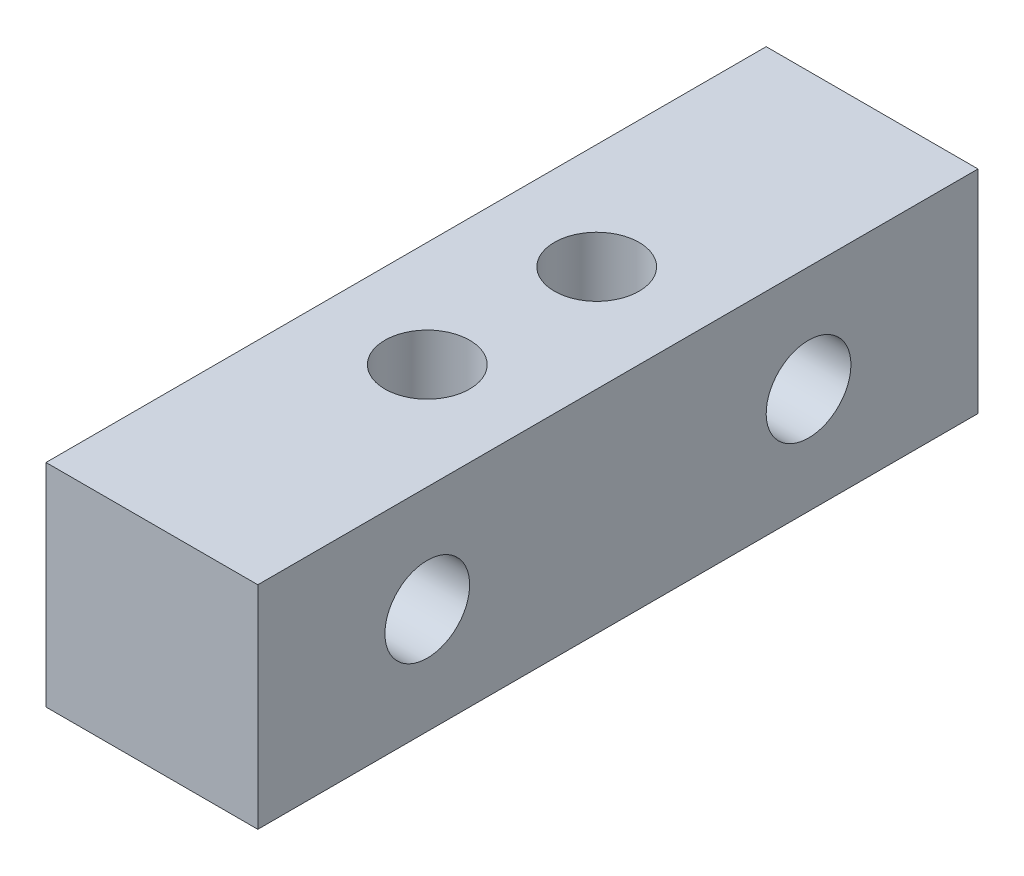
ISO-10303-21;
HEADER;
FILE_DESCRIPTION(('STEP AP214'),'2;1');
FILE_NAME('part.step','',(''),(''),'','','');
FILE_SCHEMA(('AUTOMOTIVE_DESIGN { 1 0 10303 214 1 1 1 1 }'));
ENDSEC;
DATA;
#1=APPLICATION_CONTEXT('core data for automotive mechanical design processes');
#2=APPLICATION_PROTOCOL_DEFINITION('international standard','automotive_design',2000,#1);
#3=PRODUCT_CONTEXT('',#1,'mechanical');
#4=PRODUCT('Part','Part','',(#3));
#5=PRODUCT_RELATED_PRODUCT_CATEGORY('part','',(#4));
#6=PRODUCT_DEFINITION_FORMATION('','',#4);
#7=PRODUCT_DEFINITION_CONTEXT('part definition',#1,'design');
#8=PRODUCT_DEFINITION('design','',#6,#7);
#9=PRODUCT_DEFINITION_SHAPE('','',#8);
#10=(LENGTH_UNIT() NAMED_UNIT(*) SI_UNIT(.MILLI.,.METRE.));
#11=(NAMED_UNIT(*) PLANE_ANGLE_UNIT() SI_UNIT($,.RADIAN.));
#12=(NAMED_UNIT(*) SI_UNIT($,.STERADIAN.) SOLID_ANGLE_UNIT());
#13=UNCERTAINTY_MEASURE_WITH_UNIT(LENGTH_MEASURE(1.E-05),#10,'distance_accuracy_value','');
#14=(GEOMETRIC_REPRESENTATION_CONTEXT(3) GLOBAL_UNCERTAINTY_ASSIGNED_CONTEXT((#13)) GLOBAL_UNIT_ASSIGNED_CONTEXT((#10,
#11,#12)) REPRESENTATION_CONTEXT('',''));
#15=CARTESIAN_POINT('',(0.,0.,0.));
#16=DIRECTION('',(0.,0.,1.));
#17=DIRECTION('',(1.,0.,0.));
#18=AXIS2_PLACEMENT_3D('',#15,#16,#17);
#19=CARTESIAN_POINT('',(0.,0.,34.));
#20=DIRECTION('',(1.,0.,0.));
#21=DIRECTION('',(0.,0.,-1.));
#22=AXIS2_PLACEMENT_3D('',#19,#20,#21);
#23=PLANE('',#22);
#24=CARTESIAN_POINT('',(0.,-5.,26.));
#25=DIRECTION('',(1.,0.,0.));
#26=DIRECTION('',(0.,1.,0.));
#27=AXIS2_PLACEMENT_3D('',#24,#25,#26);
#28=CIRCLE('',#27,2.);
#29=CARTESIAN_POINT('',(0.,-3.,26.));
#30=VERTEX_POINT('',#29);
#31=EDGE_CURVE('E107',#30,#30,#28,.T.);
#32=ORIENTED_EDGE('',*,*,#31,.T.);
#33=EDGE_LOOP('',(#32));
#34=FACE_BOUND('',#33,.T.);
#35=CARTESIAN_POINT('',(0.,-5.,8.));
#36=DIRECTION('',(1.,0.,0.));
#37=DIRECTION('',(0.,1.,0.));
#38=AXIS2_PLACEMENT_3D('',#35,#36,#37);
#39=CIRCLE('',#38,2.);
#40=CARTESIAN_POINT('',(0.,-3.,8.));
#41=VERTEX_POINT('',#40);
#42=EDGE_CURVE('E118',#41,#41,#39,.T.);
#43=ORIENTED_EDGE('',*,*,#42,.T.);
#44=EDGE_LOOP('',(#43));
#45=FACE_BOUND('',#44,.T.);
#46=DIRECTION('',(0.,-1.,0.));
#47=VECTOR('',#46,1.);
#48=CARTESIAN_POINT('',(0.,0.,0.));
#49=LINE('',#48,#47);
#50=CARTESIAN_POINT('',(0.,0.,0.));
#51=VERTEX_POINT('',#50);
#52=CARTESIAN_POINT('',(0.,-10.,0.));
#53=VERTEX_POINT('',#52);
#54=EDGE_CURVE('E104',#51,#53,#49,.T.);
#55=ORIENTED_EDGE('',*,*,#54,.T.);
#56=DIRECTION('',(0.,0.,-1.));
#57=VECTOR('',#56,1.);
#58=CARTESIAN_POINT('',(0.,-10.,34.));
#59=LINE('',#58,#57);
#60=CARTESIAN_POINT('',(0.,-10.,34.));
#61=VERTEX_POINT('',#60);
#62=EDGE_CURVE('E11',#61,#53,#59,.T.);
#63=ORIENTED_EDGE('',*,*,#62,.F.);
#64=DIRECTION('',(0.,-1.,0.));
#65=VECTOR('',#64,1.);
#66=CARTESIAN_POINT('',(0.,0.,34.));
#67=LINE('',#66,#65);
#68=CARTESIAN_POINT('',(0.,0.,34.));
#69=VERTEX_POINT('',#68);
#70=EDGE_CURVE('E92',#69,#61,#67,.T.);
#71=ORIENTED_EDGE('',*,*,#70,.F.);
#72=DIRECTION('',(0.,0.,-1.));
#73=VECTOR('',#72,1.);
#74=CARTESIAN_POINT('',(0.,0.,34.));
#75=LINE('',#74,#73);
#76=EDGE_CURVE('E100',#69,#51,#75,.T.);
#77=ORIENTED_EDGE('',*,*,#76,.T.);
#78=EDGE_LOOP('',(#55,#63,#71,#77));
#79=FACE_BOUND('',#78,.T.);
#80=ADVANCED_FACE('F41',(#34,#45,#79),#23,.F.);
#81=CARTESIAN_POINT('',(0.,-10.,34.));
#82=DIRECTION('',(0.,1.,0.));
#83=DIRECTION('',(0.,0.,1.));
#84=AXIS2_PLACEMENT_3D('',#81,#82,#83);
#85=PLANE('',#84);
#86=CARTESIAN_POINT('',(5.,-10.,13.));
#87=DIRECTION('',(0.,1.,0.));
#88=DIRECTION('',(0.,0.,1.));
#89=AXIS2_PLACEMENT_3D('',#86,#87,#88);
#90=CIRCLE('',#89,2.);
#91=CARTESIAN_POINT('',(5.,-10.,15.));
#92=VERTEX_POINT('',#91);
#93=EDGE_CURVE('E122',#92,#92,#90,.T.);
#94=ORIENTED_EDGE('',*,*,#93,.T.);
#95=EDGE_LOOP('',(#94));
#96=FACE_BOUND('',#95,.T.);
#97=CARTESIAN_POINT('',(5.,-10.,21.));
#98=DIRECTION('',(0.,1.,0.));
#99=DIRECTION('',(0.,0.,1.));
#100=AXIS2_PLACEMENT_3D('',#97,#98,#99);
#101=CIRCLE('',#100,2.);
#102=CARTESIAN_POINT('',(5.,-10.,23.));
#103=VERTEX_POINT('',#102);
#104=EDGE_CURVE('E130',#103,#103,#101,.T.);
#105=ORIENTED_EDGE('',*,*,#104,.T.);
#106=EDGE_LOOP('',(#105));
#107=FACE_BOUND('',#106,.T.);
#108=DIRECTION('',(1.,0.,0.));
#109=VECTOR('',#108,1.);
#110=CARTESIAN_POINT('',(0.,-10.,0.));
#111=LINE('',#110,#109);
#112=CARTESIAN_POINT('',(10.,-10.,0.));
#113=VERTEX_POINT('',#112);
#114=EDGE_CURVE('E96',#53,#113,#111,.T.);
#115=ORIENTED_EDGE('',*,*,#114,.T.);
#116=DIRECTION('',(0.,0.,-1.));
#117=VECTOR('',#116,1.);
#118=CARTESIAN_POINT('',(10.,-10.,34.));
#119=LINE('',#118,#117);
#120=CARTESIAN_POINT('',(10.,-10.,34.));
#121=VERTEX_POINT('',#120);
#122=EDGE_CURVE('E49',#121,#113,#119,.T.);
#123=ORIENTED_EDGE('',*,*,#122,.F.);
#124=DIRECTION('',(1.,0.,0.));
#125=VECTOR('',#124,1.);
#126=CARTESIAN_POINT('',(0.,-10.,34.));
#127=LINE('',#126,#125);
#128=EDGE_CURVE('E87',#61,#121,#127,.T.);
#129=ORIENTED_EDGE('',*,*,#128,.F.);
#130=ORIENTED_EDGE('',*,*,#62,.T.);
#131=EDGE_LOOP('',(#115,#123,#129,#130));
#132=FACE_BOUND('',#131,.T.);
#133=ADVANCED_FACE('F95',(#96,#107,#132),#85,.F.);
#134=CARTESIAN_POINT('',(10.,0.,34.));
#135=DIRECTION('',(-1.,0.,0.));
#136=DIRECTION('',(0.,-1.,0.));
#137=AXIS2_PLACEMENT_3D('',#134,#135,#136);
#138=PLANE('',#137);
#139=CARTESIAN_POINT('',(10.,-5.,26.));
#140=DIRECTION('',(1.,0.,0.));
#141=DIRECTION('',(0.,1.,0.));
#142=AXIS2_PLACEMENT_3D('',#139,#140,#141);
#143=CIRCLE('',#142,2.);
#144=CARTESIAN_POINT('',(10.,-3.,26.));
#145=VERTEX_POINT('',#144);
#146=EDGE_CURVE('E125',#145,#145,#143,.T.);
#147=ORIENTED_EDGE('',*,*,#146,.F.);
#148=EDGE_LOOP('',(#147));
#149=FACE_BOUND('',#148,.T.);
#150=CARTESIAN_POINT('',(10.,-5.,8.));
#151=DIRECTION('',(1.,0.,0.));
#152=DIRECTION('',(0.,1.,0.));
#153=AXIS2_PLACEMENT_3D('',#150,#151,#152);
#154=CIRCLE('',#153,2.);
#155=CARTESIAN_POINT('',(10.,-3.,8.));
#156=VERTEX_POINT('',#155);
#157=EDGE_CURVE('E121',#156,#156,#154,.T.);
#158=ORIENTED_EDGE('',*,*,#157,.F.);
#159=EDGE_LOOP('',(#158));
#160=FACE_BOUND('',#159,.T.);
#161=DIRECTION('',(0.,1.,0.));
#162=VECTOR('',#161,1.);
#163=CARTESIAN_POINT('',(10.,0.,0.));
#164=LINE('',#163,#162);
#165=CARTESIAN_POINT('',(10.,0.,0.));
#166=VERTEX_POINT('',#165);
#167=EDGE_CURVE('E74',#113,#166,#164,.T.);
#168=ORIENTED_EDGE('',*,*,#167,.T.);
#169=DIRECTION('',(0.,0.,-1.));
#170=VECTOR('',#169,1.);
#171=CARTESIAN_POINT('',(10.,0.,34.));
#172=LINE('',#171,#170);
#173=CARTESIAN_POINT('',(10.,0.,34.));
#174=VERTEX_POINT('',#173);
#175=EDGE_CURVE('E97',#174,#166,#172,.T.);
#176=ORIENTED_EDGE('',*,*,#175,.F.);
#177=DIRECTION('',(0.,1.,0.));
#178=VECTOR('',#177,1.);
#179=CARTESIAN_POINT('',(10.,0.,34.));
#180=LINE('',#179,#178);
#181=EDGE_CURVE('E90',#121,#174,#180,.T.);
#182=ORIENTED_EDGE('',*,*,#181,.F.);
#183=ORIENTED_EDGE('',*,*,#122,.T.);
#184=EDGE_LOOP('',(#168,#176,#182,#183));
#185=FACE_BOUND('',#184,.T.);
#186=ADVANCED_FACE('F98',(#149,#160,#185),#138,.F.);
#187=CARTESIAN_POINT('',(0.,0.,34.));
#188=DIRECTION('',(0.,-1.,0.));
#189=DIRECTION('',(0.,0.,-1.));
#190=AXIS2_PLACEMENT_3D('',#187,#188,#189);
#191=PLANE('',#190);
#192=CARTESIAN_POINT('',(5.,0.,13.));
#193=DIRECTION('',(0.,1.,0.));
#194=DIRECTION('',(0.,0.,1.));
#195=AXIS2_PLACEMENT_3D('',#192,#193,#194);
#196=CIRCLE('',#195,2.);
#197=CARTESIAN_POINT('',(5.,0.,15.));
#198=VERTEX_POINT('',#197);
#199=EDGE_CURVE('E136',#198,#198,#196,.T.);
#200=ORIENTED_EDGE('',*,*,#199,.F.);
#201=EDGE_LOOP('',(#200));
#202=FACE_BOUND('',#201,.T.);
#203=CARTESIAN_POINT('',(5.,0.,21.));
#204=DIRECTION('',(0.,1.,0.));
#205=DIRECTION('',(0.,0.,1.));
#206=AXIS2_PLACEMENT_3D('',#203,#204,#205);
#207=CIRCLE('',#206,2.);
#208=CARTESIAN_POINT('',(5.,0.,23.));
#209=VERTEX_POINT('',#208);
#210=EDGE_CURVE('E133',#209,#209,#207,.T.);
#211=ORIENTED_EDGE('',*,*,#210,.F.);
#212=EDGE_LOOP('',(#211));
#213=FACE_BOUND('',#212,.T.);
#214=DIRECTION('',(-1.,0.,0.));
#215=VECTOR('',#214,1.);
#216=CARTESIAN_POINT('',(0.,0.,0.));
#217=LINE('',#216,#215);
#218=EDGE_CURVE('E80',#166,#51,#217,.T.);
#219=ORIENTED_EDGE('',*,*,#218,.T.);
#220=ORIENTED_EDGE('',*,*,#76,.F.);
#221=DIRECTION('',(-1.,0.,0.));
#222=VECTOR('',#221,1.);
#223=CARTESIAN_POINT('',(0.,0.,34.));
#224=LINE('',#223,#222);
#225=EDGE_CURVE('E57',#174,#69,#224,.T.);
#226=ORIENTED_EDGE('',*,*,#225,.F.);
#227=ORIENTED_EDGE('',*,*,#175,.T.);
#228=EDGE_LOOP('',(#219,#220,#226,#227));
#229=FACE_BOUND('',#228,.T.);
#230=ADVANCED_FACE('F112',(#202,#213,#229),#191,.F.);
#231=CARTESIAN_POINT('',(0.,0.,34.));
#232=DIRECTION('',(0.,0.,1.));
#233=DIRECTION('',(1.,0.,0.));
#234=AXIS2_PLACEMENT_3D('',#231,#232,#233);
#235=PLANE('',#234);
#236=ORIENTED_EDGE('',*,*,#70,.T.);
#237=ORIENTED_EDGE('',*,*,#128,.T.);
#238=ORIENTED_EDGE('',*,*,#181,.T.);
#239=ORIENTED_EDGE('',*,*,#225,.T.);
#240=EDGE_LOOP('',(#236,#237,#238,#239));
#241=FACE_BOUND('',#240,.T.);
#242=ADVANCED_FACE('F88',(#241),#235,.T.);
#243=CARTESIAN_POINT('',(0.,0.,0.));
#244=DIRECTION('',(0.,0.,1.));
#245=DIRECTION('',(1.,0.,0.));
#246=AXIS2_PLACEMENT_3D('',#243,#244,#245);
#247=PLANE('',#246);
#248=ORIENTED_EDGE('',*,*,#54,.F.);
#249=ORIENTED_EDGE('',*,*,#218,.F.);
#250=ORIENTED_EDGE('',*,*,#167,.F.);
#251=ORIENTED_EDGE('',*,*,#114,.F.);
#252=EDGE_LOOP('',(#248,#249,#250,#251));
#253=FACE_BOUND('',#252,.T.);
#254=ADVANCED_FACE('F115',(#253),#247,.F.);
#255=CARTESIAN_POINT('',(0.,-5.,8.));
#256=DIRECTION('',(1.,0.,0.));
#257=DIRECTION('',(0.,1.,0.));
#258=AXIS2_PLACEMENT_3D('',#255,#256,#257);
#259=CYLINDRICAL_SURFACE('',#258,2.);
#260=CARTESIAN_POINT('',(0.,-3.,8.));
#261=CARTESIAN_POINT('',(0.104166666666664,-3.,8.));
#262=CARTESIAN_POINT('',(0.208333333333331,-3.,8.));
#263=CARTESIAN_POINT('',(0.416666666666664,-3.,8.));
#264=CARTESIAN_POINT('',(0.520833333333331,-3.,8.));
#265=CARTESIAN_POINT('',(0.729166666666665,-3.,8.));
#266=CARTESIAN_POINT('',(0.833333333333331,-3.,8.));
#267=CARTESIAN_POINT('',(1.04166666666666,-3.,8.));
#268=CARTESIAN_POINT('',(1.14583333333333,-3.,8.));
#269=CARTESIAN_POINT('',(1.35416666666666,-3.,8.));
#270=CARTESIAN_POINT('',(1.45833333333333,-3.,8.));
#271=CARTESIAN_POINT('',(1.66666666666666,-3.,8.));
#272=CARTESIAN_POINT('',(1.77083333333333,-3.,8.));
#273=CARTESIAN_POINT('',(1.97916666666667,-3.,8.));
#274=CARTESIAN_POINT('',(2.08333333333333,-3.,8.));
#275=CARTESIAN_POINT('',(2.29166666666666,-3.,8.));
#276=CARTESIAN_POINT('',(2.39583333333333,-3.,8.));
#277=CARTESIAN_POINT('',(2.60416666666667,-3.,8.));
#278=CARTESIAN_POINT('',(2.70833333333333,-3.,8.));
#279=CARTESIAN_POINT('',(2.91666666666667,-3.,8.));
#280=CARTESIAN_POINT('',(3.02083333333333,-3.,8.));
#281=CARTESIAN_POINT('',(3.22916666666667,-3.,8.));
#282=CARTESIAN_POINT('',(3.33333333333333,-3.,8.));
#283=CARTESIAN_POINT('',(3.54166666666667,-3.,8.));
#284=CARTESIAN_POINT('',(3.64583333333333,-3.,8.));
#285=CARTESIAN_POINT('',(3.85416666666667,-3.,8.));
#286=CARTESIAN_POINT('',(3.95833333333333,-3.,8.));
#287=CARTESIAN_POINT('',(4.16666666666667,-3.,8.));
#288=CARTESIAN_POINT('',(4.27083333333333,-3.,8.));
#289=CARTESIAN_POINT('',(4.47916666666667,-3.,8.));
#290=CARTESIAN_POINT('',(4.58333333333333,-3.,8.));
#291=CARTESIAN_POINT('',(4.79166666666667,-3.,8.));
#292=CARTESIAN_POINT('',(4.89583333333333,-3.,8.));
#293=CARTESIAN_POINT('',(5.10416666666667,-3.,8.));
#294=CARTESIAN_POINT('',(5.20833333333333,-3.,8.));
#295=CARTESIAN_POINT('',(5.41666666666667,-3.,8.));
#296=CARTESIAN_POINT('',(5.52083333333333,-3.,8.));
#297=CARTESIAN_POINT('',(5.72916666666667,-3.,8.));
#298=CARTESIAN_POINT('',(5.83333333333333,-3.,8.));
#299=CARTESIAN_POINT('',(6.04166666666667,-3.,8.));
#300=CARTESIAN_POINT('',(6.14583333333333,-3.,8.));
#301=CARTESIAN_POINT('',(6.35416666666667,-3.,8.));
#302=CARTESIAN_POINT('',(6.45833333333333,-3.,8.));
#303=CARTESIAN_POINT('',(6.66666666666667,-3.,8.));
#304=CARTESIAN_POINT('',(6.77083333333333,-3.,8.));
#305=CARTESIAN_POINT('',(6.97916666666667,-3.,8.));
#306=CARTESIAN_POINT('',(7.08333333333333,-3.,8.));
#307=CARTESIAN_POINT('',(7.29166666666667,-3.,8.));
#308=CARTESIAN_POINT('',(7.39583333333333,-3.,8.));
#309=CARTESIAN_POINT('',(7.60416666666667,-3.,8.));
#310=CARTESIAN_POINT('',(7.70833333333333,-3.,8.));
#311=CARTESIAN_POINT('',(7.91666666666667,-3.,8.));
#312=CARTESIAN_POINT('',(8.02083333333333,-3.,8.));
#313=CARTESIAN_POINT('',(8.22916666666667,-3.,8.));
#314=CARTESIAN_POINT('',(8.33333333333333,-3.,8.));
#315=CARTESIAN_POINT('',(8.54166666666667,-3.,8.));
#316=CARTESIAN_POINT('',(8.64583333333333,-3.,8.));
#317=CARTESIAN_POINT('',(8.85416666666667,-3.,8.));
#318=CARTESIAN_POINT('',(8.95833333333333,-3.,8.));
#319=CARTESIAN_POINT('',(9.16666666666667,-3.,8.));
#320=CARTESIAN_POINT('',(9.27083333333333,-3.,8.));
#321=CARTESIAN_POINT('',(9.47916666666667,-3.,8.));
#322=CARTESIAN_POINT('',(9.58333333333333,-3.,8.));
#323=CARTESIAN_POINT('',(9.79166666666667,-3.,8.));
#324=CARTESIAN_POINT('',(9.89583333333333,-3.,8.));
#325=CARTESIAN_POINT('',(10.,-3.,8.));
#326=B_SPLINE_CURVE_WITH_KNOTS('',3,(#260,#261,#262,#263,#264,#265,#266,#267,#268,#269,#270,
#271,#272,#273,#274,#275,#276,#277,#278,#279,#280,#281,#282,#283,#284,#285,#286,#287,#288,#289,
#290,#291,#292,#293,#294,#295,#296,#297,#298,#299,#300,#301,#302,#303,#304,#305,#306,#307,#308,
#309,#310,#311,#312,#313,#314,#315,#316,#317,#318,#319,#320,#321,#322,#323,#324,#325),
.UNSPECIFIED.,.F.,.F.,(4,2,2,2,2,2,2,2,2,2,2,2,2,2,2,2,2,2,2,2,2,2,2,2,2,2,2,2,2,2,2,2,4),(0.,
0.3125,0.625,0.937500000000001,1.25,1.5625,1.875,2.1875,2.5,2.8125,3.125,3.4375,3.75,4.0625,
4.375,4.6875,5.,5.3125,5.625,5.9375,6.25,6.5625,6.875,7.1875,7.5,7.8125,8.125,8.4375,8.75,
9.06250000000001,9.37500000000001,9.68750000000001,10.),.UNSPECIFIED.);
#327=EDGE_CURVE('BSEAM163',#41,#156,#326,.T.);
#328=ORIENTED_EDGE('',*,*,#42,.F.);
#329=ORIENTED_EDGE('',*,*,#157,.T.);
#330=ORIENTED_EDGE('',*,*,#327,.T.);
#331=ORIENTED_EDGE('',*,*,#327,.F.);
#332=EDGE_LOOP('',(#328,#330,#329,#331));
#333=FACE_BOUND('',#332,.T.);
#334=ADVANCED_FACE('F163',(#333),#259,.F.);
#335=CARTESIAN_POINT('',(0.,-5.,26.));
#336=DIRECTION('',(1.,0.,0.));
#337=DIRECTION('',(0.,1.,0.));
#338=AXIS2_PLACEMENT_3D('',#335,#336,#337);
#339=CYLINDRICAL_SURFACE('',#338,2.);
#340=CARTESIAN_POINT('',(0.,-3.,26.));
#341=CARTESIAN_POINT('',(0.104166666666664,-3.,26.));
#342=CARTESIAN_POINT('',(0.208333333333331,-3.,26.));
#343=CARTESIAN_POINT('',(0.416666666666664,-3.,26.));
#344=CARTESIAN_POINT('',(0.520833333333331,-3.,26.));
#345=CARTESIAN_POINT('',(0.729166666666665,-3.,26.));
#346=CARTESIAN_POINT('',(0.833333333333331,-3.,26.));
#347=CARTESIAN_POINT('',(1.04166666666666,-3.,26.));
#348=CARTESIAN_POINT('',(1.14583333333333,-3.,26.));
#349=CARTESIAN_POINT('',(1.35416666666666,-3.,26.));
#350=CARTESIAN_POINT('',(1.45833333333333,-3.,26.));
#351=CARTESIAN_POINT('',(1.66666666666666,-3.,26.));
#352=CARTESIAN_POINT('',(1.77083333333333,-3.,26.));
#353=CARTESIAN_POINT('',(1.97916666666667,-3.,26.));
#354=CARTESIAN_POINT('',(2.08333333333333,-3.,26.));
#355=CARTESIAN_POINT('',(2.29166666666666,-3.,26.));
#356=CARTESIAN_POINT('',(2.39583333333333,-3.,26.));
#357=CARTESIAN_POINT('',(2.60416666666667,-3.,26.));
#358=CARTESIAN_POINT('',(2.70833333333333,-3.,26.));
#359=CARTESIAN_POINT('',(2.91666666666667,-3.,26.));
#360=CARTESIAN_POINT('',(3.02083333333333,-3.,26.));
#361=CARTESIAN_POINT('',(3.22916666666667,-3.,26.));
#362=CARTESIAN_POINT('',(3.33333333333333,-3.,26.));
#363=CARTESIAN_POINT('',(3.54166666666667,-3.,26.));
#364=CARTESIAN_POINT('',(3.64583333333333,-3.,26.));
#365=CARTESIAN_POINT('',(3.85416666666667,-3.,26.));
#366=CARTESIAN_POINT('',(3.95833333333333,-3.,26.));
#367=CARTESIAN_POINT('',(4.16666666666667,-3.,26.));
#368=CARTESIAN_POINT('',(4.27083333333333,-3.,26.));
#369=CARTESIAN_POINT('',(4.47916666666667,-3.,26.));
#370=CARTESIAN_POINT('',(4.58333333333333,-3.,26.));
#371=CARTESIAN_POINT('',(4.79166666666667,-3.,26.));
#372=CARTESIAN_POINT('',(4.89583333333333,-3.,26.));
#373=CARTESIAN_POINT('',(5.10416666666667,-3.,26.));
#374=CARTESIAN_POINT('',(5.20833333333333,-3.,26.));
#375=CARTESIAN_POINT('',(5.41666666666667,-3.,26.));
#376=CARTESIAN_POINT('',(5.52083333333333,-3.,26.));
#377=CARTESIAN_POINT('',(5.72916666666667,-3.,26.));
#378=CARTESIAN_POINT('',(5.83333333333333,-3.,26.));
#379=CARTESIAN_POINT('',(6.04166666666667,-3.,26.));
#380=CARTESIAN_POINT('',(6.14583333333333,-3.,26.));
#381=CARTESIAN_POINT('',(6.35416666666667,-3.,26.));
#382=CARTESIAN_POINT('',(6.45833333333333,-3.,26.));
#383=CARTESIAN_POINT('',(6.66666666666667,-3.,26.));
#384=CARTESIAN_POINT('',(6.77083333333333,-3.,26.));
#385=CARTESIAN_POINT('',(6.97916666666667,-3.,26.));
#386=CARTESIAN_POINT('',(7.08333333333333,-3.,26.));
#387=CARTESIAN_POINT('',(7.29166666666667,-3.,26.));
#388=CARTESIAN_POINT('',(7.39583333333333,-3.,26.));
#389=CARTESIAN_POINT('',(7.60416666666667,-3.,26.));
#390=CARTESIAN_POINT('',(7.70833333333333,-3.,26.));
#391=CARTESIAN_POINT('',(7.91666666666667,-3.,26.));
#392=CARTESIAN_POINT('',(8.02083333333333,-3.,26.));
#393=CARTESIAN_POINT('',(8.22916666666667,-3.,26.));
#394=CARTESIAN_POINT('',(8.33333333333333,-3.,26.));
#395=CARTESIAN_POINT('',(8.54166666666667,-3.,26.));
#396=CARTESIAN_POINT('',(8.64583333333333,-3.,26.));
#397=CARTESIAN_POINT('',(8.85416666666667,-3.,26.));
#398=CARTESIAN_POINT('',(8.95833333333333,-3.,26.));
#399=CARTESIAN_POINT('',(9.16666666666667,-3.,26.));
#400=CARTESIAN_POINT('',(9.27083333333333,-3.,26.));
#401=CARTESIAN_POINT('',(9.47916666666667,-3.,26.));
#402=CARTESIAN_POINT('',(9.58333333333333,-3.,26.));
#403=CARTESIAN_POINT('',(9.79166666666667,-3.,26.));
#404=CARTESIAN_POINT('',(9.89583333333333,-3.,26.));
#405=CARTESIAN_POINT('',(10.,-3.,26.));
#406=B_SPLINE_CURVE_WITH_KNOTS('',3,(#340,#341,#342,#343,#344,#345,#346,#347,#348,#349,#350,
#351,#352,#353,#354,#355,#356,#357,#358,#359,#360,#361,#362,#363,#364,#365,#366,#367,#368,#369,
#370,#371,#372,#373,#374,#375,#376,#377,#378,#379,#380,#381,#382,#383,#384,#385,#386,#387,#388,
#389,#390,#391,#392,#393,#394,#395,#396,#397,#398,#399,#400,#401,#402,#403,#404,#405),
.UNSPECIFIED.,.F.,.F.,(4,2,2,2,2,2,2,2,2,2,2,2,2,2,2,2,2,2,2,2,2,2,2,2,2,2,2,2,2,2,2,2,4),(0.,
0.3125,0.625,0.937500000000001,1.25,1.5625,1.875,2.1875,2.5,2.8125,3.125,3.4375,3.75,4.0625,
4.375,4.6875,5.,5.3125,5.625,5.9375,6.25,6.5625,6.875,7.1875,7.5,7.8125,8.125,8.4375,8.75,
9.06250000000001,9.37500000000001,9.68750000000001,10.),.UNSPECIFIED.);
#407=EDGE_CURVE('BSEAM157',#30,#145,#406,.T.);
#408=ORIENTED_EDGE('',*,*,#31,.F.);
#409=ORIENTED_EDGE('',*,*,#146,.T.);
#410=ORIENTED_EDGE('',*,*,#407,.T.);
#411=ORIENTED_EDGE('',*,*,#407,.F.);
#412=EDGE_LOOP('',(#408,#410,#409,#411));
#413=FACE_BOUND('',#412,.T.);
#414=ADVANCED_FACE('F157',(#413),#339,.F.);
#415=CARTESIAN_POINT('',(5.,-10.,21.));
#416=DIRECTION('',(0.,1.,0.));
#417=DIRECTION('',(0.,0.,1.));
#418=AXIS2_PLACEMENT_3D('',#415,#416,#417);
#419=CYLINDRICAL_SURFACE('',#418,2.);
#420=ORIENTED_EDGE('',*,*,#104,.F.);
#421=EDGE_LOOP('',(#420));
#422=FACE_BOUND('',#421,.T.);
#423=ORIENTED_EDGE('',*,*,#210,.T.);
#424=EDGE_LOOP('',(#423));
#425=FACE_BOUND('',#424,.T.);
#426=ADVANCED_FACE('F147',(#422,#425),#419,.F.);
#427=CARTESIAN_POINT('',(5.,-10.,13.));
#428=DIRECTION('',(0.,1.,0.));
#429=DIRECTION('',(0.,0.,1.));
#430=AXIS2_PLACEMENT_3D('',#427,#428,#429);
#431=CYLINDRICAL_SURFACE('',#430,2.);
#432=ORIENTED_EDGE('',*,*,#93,.F.);
#433=EDGE_LOOP('',(#432));
#434=FACE_BOUND('',#433,.T.);
#435=ORIENTED_EDGE('',*,*,#199,.T.);
#436=EDGE_LOOP('',(#435));
#437=FACE_BOUND('',#436,.T.);
#438=ADVANCED_FACE('F144',(#434,#437),#431,.F.);
#439=CLOSED_SHELL('',(#80,#133,#186,#230,#242,#254,#334,#414,#426,#438));
#440=MANIFOLD_SOLID_BREP('B2',#439);
#441=ADVANCED_BREP_SHAPE_REPRESENTATION('',(#18,#440),#14);
#442=SHAPE_DEFINITION_REPRESENTATION(#9,#441);
ENDSEC;
END-ISO-10303-21;
